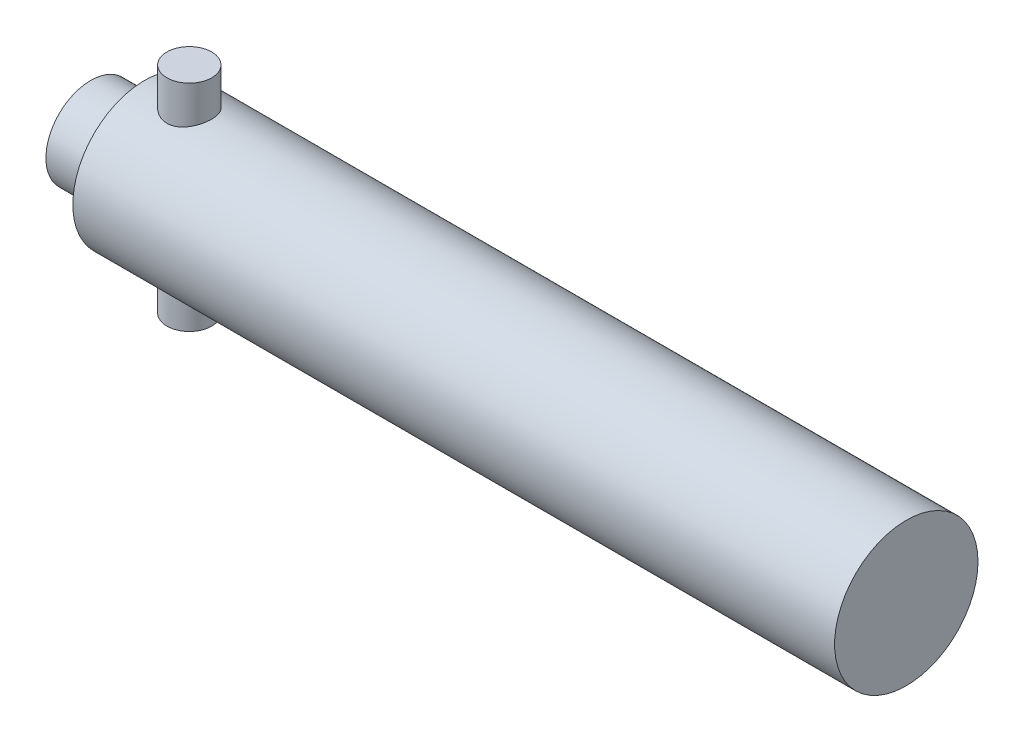
ISO-10303-21;
HEADER;
FILE_DESCRIPTION(('STEP AP214'),'2;1');
FILE_NAME('part.step','',(''),(''),'','','');
FILE_SCHEMA(('AUTOMOTIVE_DESIGN { 1 0 10303 214 1 1 1 1 }'));
ENDSEC;
DATA;
#1=APPLICATION_CONTEXT('core data for automotive mechanical design processes');
#2=APPLICATION_PROTOCOL_DEFINITION('international standard','automotive_design',2000,#1);
#3=PRODUCT_CONTEXT('',#1,'mechanical');
#4=PRODUCT('Part','Part','',(#3));
#5=PRODUCT_RELATED_PRODUCT_CATEGORY('part','',(#4));
#6=PRODUCT_DEFINITION_FORMATION('','',#4);
#7=PRODUCT_DEFINITION_CONTEXT('part definition',#1,'design');
#8=PRODUCT_DEFINITION('design','',#6,#7);
#9=PRODUCT_DEFINITION_SHAPE('','',#8);
#10=(LENGTH_UNIT() NAMED_UNIT(*) SI_UNIT(.MILLI.,.METRE.));
#11=(NAMED_UNIT(*) PLANE_ANGLE_UNIT() SI_UNIT($,.RADIAN.));
#12=(NAMED_UNIT(*) SI_UNIT($,.STERADIAN.) SOLID_ANGLE_UNIT());
#13=UNCERTAINTY_MEASURE_WITH_UNIT(LENGTH_MEASURE(1.E-05),#10,'distance_accuracy_value','');
#14=(GEOMETRIC_REPRESENTATION_CONTEXT(3) GLOBAL_UNCERTAINTY_ASSIGNED_CONTEXT((#13)) GLOBAL_UNIT_ASSIGNED_CONTEXT((#10,
#11,#12)) REPRESENTATION_CONTEXT('',''));
#15=CARTESIAN_POINT('',(0.,0.,0.));
#16=DIRECTION('',(0.,0.,1.));
#17=DIRECTION('',(1.,0.,0.));
#18=AXIS2_PLACEMENT_3D('',#15,#16,#17);
#19=CARTESIAN_POINT('',(539.75,0.,0.));
#20=DIRECTION('',(-1.,0.,0.));
#21=DIRECTION('',(0.,0.,1.));
#22=AXIS2_PLACEMENT_3D('',#19,#20,#21);
#23=CYLINDRICAL_SURFACE('',#22,101.6);
#24=CARTESIAN_POINT('',(539.75,0.,0.));
#25=DIRECTION('',(1.,0.,0.));
#26=DIRECTION('',(0.,0.,-1.));
#27=AXIS2_PLACEMENT_3D('',#24,#25,#26);
#28=CIRCLE('',#27,101.6);
#29=CARTESIAN_POINT('',(539.75,0.,-101.6));
#30=VERTEX_POINT('',#29);
#31=EDGE_CURVE('E62',#30,#30,#28,.T.);
#32=ORIENTED_EDGE('',*,*,#31,.F.);
#33=EDGE_LOOP('',(#32));
#34=FACE_BOUND('',#33,.T.);
#35=CARTESIAN_POINT('',(-539.75,0.,0.));
#36=DIRECTION('',(1.,0.,0.));
#37=DIRECTION('',(0.,0.,-1.));
#38=AXIS2_PLACEMENT_3D('',#35,#36,#37);
#39=CIRCLE('',#38,101.6);
#40=CARTESIAN_POINT('',(-539.75,0.,-101.6));
#41=VERTEX_POINT('',#40);
#42=EDGE_CURVE('E58',#41,#41,#39,.T.);
#43=ORIENTED_EDGE('',*,*,#42,.T.);
#44=EDGE_LOOP('',(#43));
#45=FACE_BOUND('',#44,.T.);
#46=CARTESIAN_POINT('',(-476.25,-96.5116443751737,-31.75));
#47=CARTESIAN_POINT('',(-475.381969677895,-96.5116451670047,-31.7499989798817));
#48=CARTESIAN_POINT('',(-474.513922051287,-96.5233868502887,-31.7143728151661));
#49=CARTESIAN_POINT('',(-472.784272924989,-96.5699811755499,-31.5722073144169));
#50=CARTESIAN_POINT('',(-471.92267160065,-96.6048344439135,-31.4656660563921));
#51=CARTESIAN_POINT('',(-470.212034498799,-96.6965605784097,-31.1826434371606));
#52=CARTESIAN_POINT('',(-469.363001642817,-96.7534384832297,-31.0061460715228));
#53=CARTESIAN_POINT('',(-467.68372328467,-96.8874500462763,-30.584813407392));
#54=CARTESIAN_POINT('',(-466.853477766978,-96.9645836877616,-30.3399781653794));
#55=CARTESIAN_POINT('',(-465.218888379056,-97.1366224475111,-29.7845740362748));
#56=CARTESIAN_POINT('',(-464.414500358494,-97.2314951559143,-29.4741248951955));
#57=CARTESIAN_POINT('',(-462.835238383269,-97.4363390993219,-28.7897087101453));
#58=CARTESIAN_POINT('',(-462.06036440786,-97.5463103237122,-28.4157417108259));
#59=CARTESIAN_POINT('',(-460.544795653733,-97.7782694287678,-27.6070085347753));
#60=CARTESIAN_POINT('',(-459.804105262858,-97.9002588458367,-27.172234581504));
#61=CARTESIAN_POINT('',(-458.36138460391,-98.1529191087325,-26.2449107363933));
#62=CARTESIAN_POINT('',(-457.659355262442,-98.28359016247,-25.7523594606679));
#63=CARTESIAN_POINT('',(-456.276807590266,-98.5543104019426,-24.6964380994645));
#64=CARTESIAN_POINT('',(-455.597641199905,-98.6945249362583,-24.1313395250295));
#65=CARTESIAN_POINT('',(-454.288918927031,-98.9766546975334,-22.9467311893278));
#66=CARTESIAN_POINT('',(-453.65936396741,-99.1185699560738,-22.3272204163179));
#67=CARTESIAN_POINT('',(-452.453729001468,-99.4002834155522,-21.0375677890379));
#68=CARTESIAN_POINT('',(-451.877656175272,-99.5400813301286,-20.3674191583382));
#69=CARTESIAN_POINT('',(-450.782834732152,-99.8137916359836,-18.9806854136896));
#70=CARTESIAN_POINT('',(-450.264086570348,-99.9477039805296,-18.2640999311353));
#71=CARTESIAN_POINT('',(-449.276408029371,-100.208982378514,-16.7721839405678));
#72=CARTESIAN_POINT('',(-448.80887411266,-100.336131121173,-15.9958897801277));
#73=CARTESIAN_POINT('',(-447.941101223515,-100.576922835051,-14.4045172892275));
#74=CARTESIAN_POINT('',(-447.540863569318,-100.690565541693,-13.5894381994274));
#75=CARTESIAN_POINT('',(-446.811071385049,-100.901069871515,-11.9262928598228));
#76=CARTESIAN_POINT('',(-446.481504012756,-100.997934542988,-11.0782326365041));
#77=CARTESIAN_POINT('',(-445.895894899245,-101.17208588931,-9.35514296371683));
#78=CARTESIAN_POINT('',(-445.639850418506,-101.249373293612,-8.48011452045113));
#79=CARTESIAN_POINT('',(-445.210423089129,-101.380039020762,-6.73704728667637));
#80=CARTESIAN_POINT('',(-445.034732560005,-101.434081741132,-5.86962653036055));
#81=CARTESIAN_POINT('',(-444.756288962768,-101.520115016805,-4.12207094028613));
#82=CARTESIAN_POINT('',(-444.65353453041,-101.552105984579,-3.24193634464989));
#83=CARTESIAN_POINT('',(-444.521960017491,-101.593120370437,-1.47579714485987));
#84=CARTESIAN_POINT('',(-444.49312543731,-101.602148292796,-0.589793726084896));
#85=CARTESIAN_POINT('',(-444.509630931212,-101.596990358912,1.18144498005426));
#86=CARTESIAN_POINT('',(-444.554969516513,-101.582804968598,2.06668028247901));
#87=CARTESIAN_POINT('',(-444.716526981583,-101.532516072369,3.79909132953033));
#88=CARTESIAN_POINT('',(-444.830240678498,-101.497187435003,4.6465246528835));
#89=CARTESIAN_POINT('',(-445.125364055328,-101.406216625182,6.32838403875714));
#90=CARTESIAN_POINT('',(-445.30677189855,-101.350575003865,7.16281045354411));
#91=CARTESIAN_POINT('',(-445.735733166584,-101.220433987972,8.81299363755912));
#92=CARTESIAN_POINT('',(-445.983289043875,-101.145933894214,9.6287497133554));
#93=CARTESIAN_POINT('',(-446.542518037744,-100.980001641567,11.2362013719097));
#94=CARTESIAN_POINT('',(-446.854192449248,-100.888569140719,12.0278964683664));
#95=CARTESIAN_POINT('',(-447.543432976462,-100.689891802238,13.5917088494713));
#96=CARTESIAN_POINT('',(-447.921757157604,-100.582467528636,14.3634690642786));
#97=CARTESIAN_POINT('',(-448.7388189262,-100.355411586515,15.8724158526172));
#98=CARTESIAN_POINT('',(-449.177556740216,-100.235779872216,16.6096022964773));
#99=CARTESIAN_POINT('',(-450.112502262845,-99.9873152520785,18.0451546519251));
#100=CARTESIAN_POINT('',(-450.608721944574,-99.858480431441,18.7435124307492));
#101=CARTESIAN_POINT('',(-451.655336304049,-99.5948721191023,20.0971898846733));
#102=CARTESIAN_POINT('',(-452.205732504696,-99.4600984605196,20.7525083490761));
#103=CARTESIAN_POINT('',(-453.38134775542,-99.1823227401719,22.0426926602451));
#104=CARTESIAN_POINT('',(-454.008730039117,-99.0392119313202,22.6755655885787));
#105=CARTESIAN_POINT('',(-455.314603882386,-98.7541511870177,23.8864952157735));
#106=CARTESIAN_POINT('',(-455.99309688317,-98.6122012844271,24.4645503678537));
#107=CARTESIAN_POINT('',(-457.397026951549,-98.3334064700594,25.5621183833457));
#108=CARTESIAN_POINT('',(-458.122469837508,-98.1965621943333,26.0816239689277));
#109=CARTESIAN_POINT('',(-459.615675610736,-97.9319072635223,27.0584124266439));
#110=CARTESIAN_POINT('',(-460.383438353357,-97.804096577564,27.5156955114369));
#111=CARTESIAN_POINT('',(-461.965228548705,-97.5599042391345,28.3694296310796));
#112=CARTESIAN_POINT('',(-462.779679014548,-97.4436671938668,28.7651391537138));
#113=CARTESIAN_POINT('',(-464.441313901456,-97.2278977538031,29.4862282194784));
#114=CARTESIAN_POINT('',(-465.288498725316,-97.1283655646402,29.8116068968655));
#115=CARTESIAN_POINT('',(-467.009288007874,-96.9492462836408,30.3890623619716));
#116=CARTESIAN_POINT('',(-467.882884598445,-96.8696533162139,30.641160747081));
#117=CARTESIAN_POINT('',(-469.650151084086,-96.7330326696111,31.0697781465098));
#118=CARTESIAN_POINT('',(-470.543820089949,-96.6760039929126,31.2463005019238));
#119=CARTESIAN_POINT('',(-472.308021744607,-96.5882597965891,31.5164621739086));
#120=CARTESIAN_POINT('',(-473.178040926753,-96.5565789416421,31.6131471952657));
#121=CARTESIAN_POINT('',(-474.923623370444,-96.5168147639428,31.7343440182681));
#122=CARTESIAN_POINT('',(-475.799186483216,-96.5087308106326,31.7588577484798));
#123=CARTESIAN_POINT('',(-477.549112230007,-96.5164219822188,31.7354757727173));
#124=CARTESIAN_POINT('',(-478.423475014223,-96.5321937846891,31.6875901499077));
#125=CARTESIAN_POINT('',(-480.164525139063,-96.5870795826674,31.5198955945349));
#126=CARTESIAN_POINT('',(-481.031212553791,-96.6261933525651,31.4000873571351));
#127=CARTESIAN_POINT('',(-482.725563545693,-96.7250528321715,31.0941974096744));
#128=CARTESIAN_POINT('',(-483.553630150111,-96.7841677698192,30.9101369538135));
#129=CARTESIAN_POINT('',(-485.190887990534,-96.9214706861785,30.4768782071948));
#130=CARTESIAN_POINT('',(-486.000079679506,-96.9996582066628,30.2276814813545));
#131=CARTESIAN_POINT('',(-487.594483091379,-97.1728696608586,29.6661364092645));
#132=CARTESIAN_POINT('',(-488.379691921194,-97.2678956164827,29.3537804783959));
#133=CARTESIAN_POINT('',(-489.92118697613,-97.4721242866476,28.6683243449778));
#134=CARTESIAN_POINT('',(-490.677472339485,-97.5813274231673,28.2952223342581));
#135=CARTESIAN_POINT('',(-492.177976714023,-97.8142786026435,27.4792994714734));
#136=CARTESIAN_POINT('',(-492.92122833799,-97.9383538568733,27.0347866312349));
#137=CARTESIAN_POINT('',(-494.006066176379,-98.1307726236237,26.3243541583424));
#138=CARTESIAN_POINT('',(-494.362690160681,-98.1959667891114,26.0802521413596));
#139=CARTESIAN_POINT('',(-495.065563064148,-98.3280416328819,25.5777977034132));
#140=CARTESIAN_POINT('',(-495.411809580904,-98.3949226951862,25.3194420214197));
#141=CARTESIAN_POINT('',(-496.434117196091,-98.5974134989207,24.5236550729191));
#142=CARTESIAN_POINT('',(-497.093814574931,-98.7348830890183,23.9654592085498));
#143=CARTESIAN_POINT('',(-498.365391040439,-99.0111240695357,22.7973107361091));
#144=CARTESIAN_POINT('',(-498.97726920783,-99.1498954849245,22.1873571335165));
#145=CARTESIAN_POINT('',(-499.868577791557,-99.3591800349055,21.2232793946207));
#146=CARTESIAN_POINT('',(-500.16684215275,-99.4305442947347,20.8865853750696));
#147=CARTESIAN_POINT('',(-500.748839563717,-99.5721396973692,20.2007820744333));
#148=CARTESIAN_POINT('',(-501.032576045194,-99.6423711050614,19.8516757586394));
#149=CARTESIAN_POINT('',(-501.861420884825,-99.850669642653,18.7863516429658));
#150=CARTESIAN_POINT('',(-502.384209058797,-99.9863516264663,18.0520806271221));
#151=CARTESIAN_POINT('',(-503.366135834801,-100.247484753934,16.5405597567202));
#152=CARTESIAN_POINT('',(-503.825275520396,-100.372936071742,15.7633106341445));
#153=CARTESIAN_POINT('',(-504.676468356476,-100.610111266224,14.1708618574423));
#154=CARTESIAN_POINT('',(-505.068522858264,-100.721835419392,13.3556629681628));
#155=CARTESIAN_POINT('',(-505.779657808274,-100.927613332156,11.6990742475918));
#156=CARTESIAN_POINT('',(-506.099254269946,-101.021791132392,10.8579214326155));
#157=CARTESIAN_POINT('',(-506.666355046036,-101.190804089143,9.14973544602849));
#158=CARTESIAN_POINT('',(-506.913859373766,-101.265639249231,8.28270227919714));
#159=CARTESIAN_POINT('',(-507.334426107264,-101.393781357175,6.52942924389282));
#160=CARTESIAN_POINT('',(-507.507507825853,-101.447093889978,5.64319442106905));
#161=CARTESIAN_POINT('',(-507.777638130755,-101.530650093933,3.85814481155571));
#162=CARTESIAN_POINT('',(-507.874689519339,-101.560894615308,2.95933048975536));
#163=CARTESIAN_POINT('',(-507.989360446746,-101.596662015788,1.19381073601245));
#164=CARTESIAN_POINT('',(-508.010120693371,-101.603162312137,0.327327598956075));
#165=CARTESIAN_POINT('',(-507.980745786436,-101.593983648031,-1.40430190045025));
#166=CARTESIAN_POINT('',(-507.930612730558,-101.578305343825,-2.26944830159495));
#167=CARTESIAN_POINT('',(-507.759924519796,-101.525200283407,-3.99202133563812));
#168=CARTESIAN_POINT('',(-507.639374106193,-101.487774991444,-4.84944848433611));
#169=CARTESIAN_POINT('',(-507.328951208439,-101.392193629452,-6.55047837444202));
#170=CARTESIAN_POINT('',(-507.139078479587,-101.334037486246,-7.39408106703989));
#171=CARTESIAN_POINT('',(-506.694492043494,-101.199408799385,-9.05107758845541));
#172=CARTESIAN_POINT('',(-506.440622420029,-101.123175406777,-9.86471772398901));
#173=CARTESIAN_POINT('',(-505.868993674698,-100.953988511858,-11.4674135010197));
#174=CARTESIAN_POINT('',(-505.551235394424,-100.861035229796,-12.2564694662008));
#175=CARTESIAN_POINT('',(-504.85422477718,-100.660755944511,-13.8051437293551));
#176=CARTESIAN_POINT('',(-504.474964616964,-100.5534281131,-14.5647582670289));
#177=CARTESIAN_POINT('',(-503.657704493529,-100.327093273025,-16.0498808398705));
#178=CARTESIAN_POINT('',(-503.219702839328,-100.208085928172,-16.7753878923794));
#179=CARTESIAN_POINT('',(-502.272094852146,-99.9571468003044,-18.2120412776282));
#180=CARTESIAN_POINT('',(-501.760563625417,-99.8249135446923,-18.9218657309421));
#181=CARTESIAN_POINT('',(-500.681310649424,-99.5545758871187,-20.2962320546217));
#182=CARTESIAN_POINT('',(-500.113587736224,-99.4164713635755,-20.9607729865179));
#183=CARTESIAN_POINT('',(-498.925414269352,-99.1379763521186,-22.2407465745816));
#184=CARTESIAN_POINT('',(-498.30494926048,-98.9975852460919,-22.8561656775733));
#185=CARTESIAN_POINT('',(-497.015233485657,-98.7182665473738,-24.0339393509743));
#186=CARTESIAN_POINT('',(-496.345982041661,-98.5793389750538,-24.5962931836212));
#187=CARTESIAN_POINT('',(-494.93974452979,-98.3021535235925,-25.6821142255678));
#188=CARTESIAN_POINT('',(-494.201247751475,-98.1640708386015,-26.2036718690836));
#189=CARTESIAN_POINT('',(-492.681193528928,-97.8975069078193,-27.1826347235231));
#190=CARTESIAN_POINT('',(-491.899634410397,-97.7690260358125,-27.6400374375963));
#191=CARTESIAN_POINT('',(-490.298900416217,-97.5256051517723,-28.4870240323994));
#192=CARTESIAN_POINT('',(-489.479738413591,-97.410660553056,-28.8766309068293));
#193=CARTESIAN_POINT('',(-487.809205006086,-97.1978739870539,-29.5849657542392));
#194=CARTESIAN_POINT('',(-486.957836273762,-97.100030604459,-29.9036995933188));
#195=CARTESIAN_POINT('',(-485.302756709763,-96.9320947950975,-30.4434209195731));
#196=CARTESIAN_POINT('',(-484.501170729247,-96.8603476468594,-30.6704250039047));
#197=CARTESIAN_POINT('',(-482.881257142156,-96.7358213734409,-31.060955514167));
#198=CARTESIAN_POINT('',(-482.062930674591,-96.6830409622838,-31.2244862437579));
#199=CARTESIAN_POINT('',(-480.415062368291,-96.5979729659136,-31.4866742850421));
#200=CARTESIAN_POINT('',(-479.585522895872,-96.5656811238152,-31.5853450727608));
#201=CARTESIAN_POINT('',(-477.920661108577,-96.5225160253668,-31.7170097153163));
#202=CARTESIAN_POINT('',(-477.08533856709,-96.5116436131646,-31.7500009816985));
#203=CARTESIAN_POINT('',(-476.25,-96.5116443751737,-31.75));
#204=B_SPLINE_CURVE_WITH_KNOTS('',3,(#46,#47,#48,#49,#50,#51,#52,#53,#54,#55,#56,#57,#58,#59,
#60,#61,#62,#63,#64,#65,#66,#67,#68,#69,#70,#71,#72,#73,#74,#75,#76,#77,#78,#79,#80,#81,#82,#83,
#84,#85,#86,#87,#88,#89,#90,#91,#92,#93,#94,#95,#96,#97,#98,#99,#100,#101,#102,#103,#104,#105,
#106,#107,#108,#109,#110,#111,#112,#113,#114,#115,#116,#117,#118,#119,#120,#121,#122,#123,#124,
#125,#126,#127,#128,#129,#130,#131,#132,#133,#134,#135,#136,#137,#138,#139,#140,#141,#142,#143,
#144,#145,#146,#147,#148,#149,#150,#151,#152,#153,#154,#155,#156,#157,#158,#159,#160,#161,#162,
#163,#164,#165,#166,#167,#168,#169,#170,#171,#172,#173,#174,#175,#176,#177,#178,#179,#180,#181,
#182,#183,#184,#185,#186,#187,#188,#189,#190,#191,#192,#193,#194,#195,#196,#197,#198,#199,#200,
#201,#202,#203),.UNSPECIFIED.,.T.,.F.,(4,2,2,2,2,2,2,2,2,2,2,2,2,2,2,2,2,2,2,2,2,2,2,2,2,2,2,2,
2,2,2,2,2,2,2,2,2,2,2,2,2,2,2,2,2,2,2,2,2,2,2,2,2,2,2,2,2,2,2,2,2,2,2,2,2,2,2,2,2,2,2,2,2,2,2,2,
2,2,4),(0.,2.60331470834522,5.20669997644033,7.81068118638201,10.4146602441773,13.0139274284392,
15.6131927854833,18.212790864446,20.8124512218671,23.4931179898877,26.1738346129214,
28.8549106107349,31.5360078929421,34.2779036968347,37.0198532042851,39.7613040209559,
42.5026526757475,45.1593793724529,47.8160563746581,50.4722122211086,53.1283147546671,
55.6925718658061,58.2567594080045,60.8210420321971,63.3853764491962,65.9810210999692,
68.5766754851077,71.1728715043717,73.7691405234558,76.4736918503091,79.1783194681899,
81.883282906836,84.5882371004543,87.3235945199622,90.0589856086653,92.7935696953035,
95.5280328778971,98.1526075093155,100.777112006027,103.401251017798,106.025364666534,
108.573430456487,111.121435034052,113.66974577654,116.218132386018,118.839572129573,
120.15042993299,121.461588895268,124.083660162163,126.705781823375,128.071715136629,
129.437324293254,132.168344406095,134.899318019823,137.630236616777,140.341049075631,
143.051861033877,145.761969105614,148.471977285415,151.069085953812,153.666117777278,
156.262974759832,158.859840909141,161.424100567555,163.988326449736,166.552878766318,
169.117504924101,171.769123998777,174.420798009705,177.073201131513,179.725641124046,
182.466096221723,185.206657945794,187.946288359029,190.685691930957,193.191552590531,
195.697243316476,198.202413267462,200.707681946187),.UNSPECIFIED.);
#205=CARTESIAN_POINT('',(-476.25,-96.5116443751737,-31.75));
#206=VERTEX_POINT('',#205);
#207=EDGE_CURVE('E51',#206,#206,#204,.T.);
#208=ORIENTED_EDGE('',*,*,#207,.F.);
#209=EDGE_LOOP('',(#208));
#210=FACE_BOUND('',#209,.T.);
#211=CARTESIAN_POINT('',(-476.25,96.5116443751737,-31.75));
#212=CARTESIAN_POINT('',(-477.118030322105,96.5116451670048,-31.7499989798817));
#213=CARTESIAN_POINT('',(-477.986077948713,96.5233868502887,-31.7143728151661));
#214=CARTESIAN_POINT('',(-479.715727075011,96.5699811755499,-31.5722073144169));
#215=CARTESIAN_POINT('',(-480.57732839935,96.6048344439135,-31.4656660563921));
#216=CARTESIAN_POINT('',(-482.287965501201,96.6965605784097,-31.1826434371606));
#217=CARTESIAN_POINT('',(-483.136998357183,96.7534384832297,-31.0061460715228));
#218=CARTESIAN_POINT('',(-484.81627671533,96.8874500462763,-30.584813407392));
#219=CARTESIAN_POINT('',(-485.646522233022,96.9645836877616,-30.3399781653794));
#220=CARTESIAN_POINT('',(-487.281111620944,97.1366224475111,-29.7845740362748));
#221=CARTESIAN_POINT('',(-488.085499641506,97.2314951559143,-29.4741248951955));
#222=CARTESIAN_POINT('',(-489.664761616731,97.4363390993219,-28.7897087101452));
#223=CARTESIAN_POINT('',(-490.43963559214,97.5463103237123,-28.4157417108259));
#224=CARTESIAN_POINT('',(-491.955204346267,97.7782694287678,-27.6070085347753));
#225=CARTESIAN_POINT('',(-492.695894737142,97.9002588458367,-27.172234581504));
#226=CARTESIAN_POINT('',(-494.13861539609,98.1529191087325,-26.2449107363933));
#227=CARTESIAN_POINT('',(-494.840644737558,98.28359016247,-25.7523594606679));
#228=CARTESIAN_POINT('',(-496.223192409734,98.5543104019427,-24.6964380994645));
#229=CARTESIAN_POINT('',(-496.902358800095,98.6945249362583,-24.1313395250295));
#230=CARTESIAN_POINT('',(-498.211081072969,98.9766546975334,-22.9467311893278));
#231=CARTESIAN_POINT('',(-498.84063603259,99.1185699560738,-22.3272204163179));
#232=CARTESIAN_POINT('',(-500.046270998532,99.4002834155522,-21.0375677890379));
#233=CARTESIAN_POINT('',(-500.622343824728,99.5400813301286,-20.3674191583382));
#234=CARTESIAN_POINT('',(-501.717165267847,99.8137916359836,-18.9806854136896));
#235=CARTESIAN_POINT('',(-502.235913429652,99.9477039805296,-18.2640999311353));
#236=CARTESIAN_POINT('',(-503.223591970628,100.208982378514,-16.7721839405678));
#237=CARTESIAN_POINT('',(-503.69112588734,100.336131121173,-15.9958897801276));
#238=CARTESIAN_POINT('',(-504.558898776485,100.576922835051,-14.4045172892275));
#239=CARTESIAN_POINT('',(-504.959136430682,100.690565541693,-13.5894381994274));
#240=CARTESIAN_POINT('',(-505.688928614951,100.901069871515,-11.9262928598228));
#241=CARTESIAN_POINT('',(-506.018495987244,100.997934542988,-11.078232636504));
#242=CARTESIAN_POINT('',(-506.604105100755,101.17208588931,-9.35514296371678));
#243=CARTESIAN_POINT('',(-506.860149581494,101.249373293612,-8.48011452045109));
#244=CARTESIAN_POINT('',(-507.289576910871,101.380039020762,-6.73704728667633));
#245=CARTESIAN_POINT('',(-507.465267439995,101.434081741132,-5.86962653036051));
#246=CARTESIAN_POINT('',(-507.743711037232,101.520115016805,-4.1220709402861));
#247=CARTESIAN_POINT('',(-507.84646546959,101.552105984579,-3.24193634464987));
#248=CARTESIAN_POINT('',(-507.978039982509,101.593120370437,-1.47579714485986));
#249=CARTESIAN_POINT('',(-508.00687456269,101.602148292796,-0.589793726084883));
#250=CARTESIAN_POINT('',(-507.990369068788,101.596990358912,1.18144498005427));
#251=CARTESIAN_POINT('',(-507.945030483486,101.582804968598,2.06668028247902));
#252=CARTESIAN_POINT('',(-507.783473018417,101.532516072369,3.79909132953034));
#253=CARTESIAN_POINT('',(-507.669759321501,101.497187435003,4.64652465288352));
#254=CARTESIAN_POINT('',(-507.374635944671,101.406216625182,6.32838403875716));
#255=CARTESIAN_POINT('',(-507.19322810145,101.350575003865,7.16281045354412));
#256=CARTESIAN_POINT('',(-506.764266833416,101.220433987972,8.81299363755913));
#257=CARTESIAN_POINT('',(-506.516710956125,101.145933894214,9.62874971335542));
#258=CARTESIAN_POINT('',(-505.957481962256,100.980001641567,11.2362013719097));
#259=CARTESIAN_POINT('',(-505.645807550752,100.888569140719,12.0278964683664));
#260=CARTESIAN_POINT('',(-504.956567023538,100.689891802238,13.5917088494713));
#261=CARTESIAN_POINT('',(-504.578242842396,100.582467528636,14.3634690642786));
#262=CARTESIAN_POINT('',(-503.7611810738,100.355411586515,15.8724158526172));
#263=CARTESIAN_POINT('',(-503.322443259784,100.235779872216,16.6096022964773));
#264=CARTESIAN_POINT('',(-502.387497737155,99.9873152520785,18.0451546519251));
#265=CARTESIAN_POINT('',(-501.891278055426,99.858480431441,18.7435124307491));
#266=CARTESIAN_POINT('',(-500.844663695951,99.5948721191023,20.0971898846732));
#267=CARTESIAN_POINT('',(-500.294267495304,99.4600984605196,20.7525083490761));
#268=CARTESIAN_POINT('',(-499.11865224458,99.1823227401719,22.0426926602451));
#269=CARTESIAN_POINT('',(-498.491269960883,99.0392119313202,22.6755655885786));
#270=CARTESIAN_POINT('',(-497.185396117614,98.7541511870177,23.8864952157734));
#271=CARTESIAN_POINT('',(-496.50690311683,98.6122012844271,24.4645503678537));
#272=CARTESIAN_POINT('',(-495.10297304845,98.3334064700594,25.5621183833457));
#273=CARTESIAN_POINT('',(-494.377530162492,98.1965621943333,26.0816239689277));
#274=CARTESIAN_POINT('',(-492.884324389264,97.9319072635223,27.0584124266439));
#275=CARTESIAN_POINT('',(-492.116561646643,97.804096577564,27.5156955114369));
#276=CARTESIAN_POINT('',(-490.534771451294,97.5599042391345,28.3694296310796));
#277=CARTESIAN_POINT('',(-489.720320985452,97.4436671938668,28.7651391537138));
#278=CARTESIAN_POINT('',(-488.058686098544,97.2278977538031,29.4862282194784));
#279=CARTESIAN_POINT('',(-487.211501274684,97.1283655646402,29.8116068968655));
#280=CARTESIAN_POINT('',(-485.490711992126,96.9492462836408,30.3890623619716));
#281=CARTESIAN_POINT('',(-484.617115401555,96.8696533162139,30.641160747081));
#282=CARTESIAN_POINT('',(-482.849848915914,96.7330326696111,31.0697781465098));
#283=CARTESIAN_POINT('',(-481.956179910051,96.6760039929126,31.2463005019238));
#284=CARTESIAN_POINT('',(-480.191978255393,96.5882597965891,31.5164621739086));
#285=CARTESIAN_POINT('',(-479.321959073247,96.5565789416421,31.6131471952657));
#286=CARTESIAN_POINT('',(-477.576376629556,96.5168147639428,31.7343440182681));
#287=CARTESIAN_POINT('',(-476.700813516784,96.5087308106326,31.7588577484798));
#288=CARTESIAN_POINT('',(-474.950887769993,96.5164219822188,31.7354757727173));
#289=CARTESIAN_POINT('',(-474.076524985777,96.5321937846891,31.6875901499077));
#290=CARTESIAN_POINT('',(-472.335474860937,96.5870795826674,31.5198955945349));
#291=CARTESIAN_POINT('',(-471.468787446209,96.6261933525651,31.4000873571351));
#292=CARTESIAN_POINT('',(-469.774436454306,96.7250528321715,31.0941974096744));
#293=CARTESIAN_POINT('',(-468.946369849889,96.7841677698192,30.9101369538135));
#294=CARTESIAN_POINT('',(-467.309112009466,96.9214706861785,30.4768782071948));
#295=CARTESIAN_POINT('',(-466.499920320494,96.9996582066628,30.2276814813545));
#296=CARTESIAN_POINT('',(-464.905516908621,97.1728696608586,29.6661364092645));
#297=CARTESIAN_POINT('',(-464.120308078805,97.2678956164827,29.3537804783959));
#298=CARTESIAN_POINT('',(-462.57881302387,97.4721242866476,28.6683243449778));
#299=CARTESIAN_POINT('',(-461.822527660515,97.5813274231673,28.2952223342581));
#300=CARTESIAN_POINT('',(-460.322023285977,97.8142786026435,27.4792994714734));
#301=CARTESIAN_POINT('',(-459.57877166201,97.9383538568733,27.0347866312349));
#302=CARTESIAN_POINT('',(-458.493933823621,98.1307726236237,26.3243541583424));
#303=CARTESIAN_POINT('',(-458.137309839319,98.1959667891114,26.0802521413596));
#304=CARTESIAN_POINT('',(-457.434436935852,98.3280416328819,25.5777977034131));
#305=CARTESIAN_POINT('',(-457.088190419096,98.3949226951862,25.3194420214197));
#306=CARTESIAN_POINT('',(-456.065882803909,98.5974134989207,24.5236550729191));
#307=CARTESIAN_POINT('',(-455.406185425068,98.7348830890183,23.9654592085498));
#308=CARTESIAN_POINT('',(-454.134608959561,99.0111240695358,22.7973107361091));
#309=CARTESIAN_POINT('',(-453.52273079217,99.1498954849245,22.1873571335166));
#310=CARTESIAN_POINT('',(-452.631422208443,99.3591800349055,21.2232793946207));
#311=CARTESIAN_POINT('',(-452.33315784725,99.4305442947347,20.8865853750695));
#312=CARTESIAN_POINT('',(-451.751160436283,99.5721396973693,20.2007820744332));
#313=CARTESIAN_POINT('',(-451.467423954806,99.6423711050614,19.8516757586394));
#314=CARTESIAN_POINT('',(-450.638579115174,99.850669642653,18.7863516429658));
#315=CARTESIAN_POINT('',(-450.115790941203,99.9863516264663,18.0520806271221));
#316=CARTESIAN_POINT('',(-449.133864165199,100.247484753934,16.5405597567202));
#317=CARTESIAN_POINT('',(-448.674724479603,100.372936071742,15.7633106341445));
#318=CARTESIAN_POINT('',(-447.823531643524,100.610111266224,14.1708618574422));
#319=CARTESIAN_POINT('',(-447.431477141736,100.721835419392,13.3556629681627));
#320=CARTESIAN_POINT('',(-446.720342191726,100.927613332156,11.6990742475917));
#321=CARTESIAN_POINT('',(-446.400745730053,101.021791132392,10.8579214326155));
#322=CARTESIAN_POINT('',(-445.833644953964,101.190804089143,9.14973544602845));
#323=CARTESIAN_POINT('',(-445.586140626233,101.265639249231,8.28270227919709));
#324=CARTESIAN_POINT('',(-445.165573892736,101.393781357175,6.52942924389277));
#325=CARTESIAN_POINT('',(-444.992492174147,101.447093889978,5.643194421069));
#326=CARTESIAN_POINT('',(-444.722361869245,101.530650093933,3.85814481155568));
#327=CARTESIAN_POINT('',(-444.625310480661,101.560894615308,2.95933048975534));
#328=CARTESIAN_POINT('',(-444.510639553254,101.596662015788,1.19381073601244));
#329=CARTESIAN_POINT('',(-444.489879306629,101.603162312137,0.327327598956057));
#330=CARTESIAN_POINT('',(-444.519254213563,101.593983648031,-1.40430190045026));
#331=CARTESIAN_POINT('',(-444.569387269442,101.578305343825,-2.26944830159496));
#332=CARTESIAN_POINT('',(-444.740075480204,101.525200283407,-3.99202133563812));
#333=CARTESIAN_POINT('',(-444.860625893807,101.487774991444,-4.84944848433612));
#334=CARTESIAN_POINT('',(-445.171048791561,101.392193629452,-6.55047837444202));
#335=CARTESIAN_POINT('',(-445.360921520413,101.334037486246,-7.39408106703988));
#336=CARTESIAN_POINT('',(-445.805507956506,101.199408799385,-9.05107758845541));
#337=CARTESIAN_POINT('',(-446.059377579971,101.123175406777,-9.86471772398902));
#338=CARTESIAN_POINT('',(-446.631006325301,100.953988511858,-11.4674135010198));
#339=CARTESIAN_POINT('',(-446.948764605576,100.861035229796,-12.2564694662008));
#340=CARTESIAN_POINT('',(-447.64577522282,100.660755944511,-13.8051437293552));
#341=CARTESIAN_POINT('',(-448.025035383036,100.5534281131,-14.5647582670289));
#342=CARTESIAN_POINT('',(-448.842295506471,100.327093273025,-16.0498808398705));
#343=CARTESIAN_POINT('',(-449.280297160671,100.208085928172,-16.7753878923794));
#344=CARTESIAN_POINT('',(-450.227905147854,99.9571468003044,-18.2120412776282));
#345=CARTESIAN_POINT('',(-450.739436374583,99.8249135446923,-18.9218657309421));
#346=CARTESIAN_POINT('',(-451.818689350576,99.5545758871187,-20.2962320546217));
#347=CARTESIAN_POINT('',(-452.386412263776,99.4164713635755,-20.9607729865179));
#348=CARTESIAN_POINT('',(-453.574585730648,99.1379763521186,-22.2407465745816));
#349=CARTESIAN_POINT('',(-454.19505073952,98.9975852460919,-22.8561656775733));
#350=CARTESIAN_POINT('',(-455.484766514343,98.7182665473739,-24.0339393509742));
#351=CARTESIAN_POINT('',(-456.154017958338,98.5793389750538,-24.5962931836211));
#352=CARTESIAN_POINT('',(-457.56025547021,98.3021535235925,-25.6821142255678));
#353=CARTESIAN_POINT('',(-458.298752248525,98.1640708386015,-26.2036718690836));
#354=CARTESIAN_POINT('',(-459.818806471072,97.8975069078193,-27.1826347235231));
#355=CARTESIAN_POINT('',(-460.600365589603,97.7690260358125,-27.6400374375963));
#356=CARTESIAN_POINT('',(-462.201099583783,97.5256051517723,-28.4870240323994));
#357=CARTESIAN_POINT('',(-463.020261586409,97.410660553056,-28.8766309068293));
#358=CARTESIAN_POINT('',(-464.690794993913,97.1978739870539,-29.5849657542392));
#359=CARTESIAN_POINT('',(-465.542163726238,97.100030604459,-29.9036995933187));
#360=CARTESIAN_POINT('',(-467.197243290237,96.9320947950975,-30.4434209195731));
#361=CARTESIAN_POINT('',(-467.998829270753,96.8603476468595,-30.6704250039047));
#362=CARTESIAN_POINT('',(-469.618742857844,96.7358213734409,-31.060955514167));
#363=CARTESIAN_POINT('',(-470.437069325409,96.6830409622838,-31.2244862437579));
#364=CARTESIAN_POINT('',(-472.084937631709,96.5979729659136,-31.4866742850421));
#365=CARTESIAN_POINT('',(-472.914477104128,96.5656811238152,-31.5853450727607));
#366=CARTESIAN_POINT('',(-474.579338891423,96.5225160253668,-31.7170097153163));
#367=CARTESIAN_POINT('',(-475.41466143291,96.5116436131647,-31.7500009816985));
#368=CARTESIAN_POINT('',(-476.25,96.5116443751737,-31.75));
#369=B_SPLINE_CURVE_WITH_KNOTS('',3,(#211,#212,#213,#214,#215,#216,#217,#218,#219,#220,#221,
#222,#223,#224,#225,#226,#227,#228,#229,#230,#231,#232,#233,#234,#235,#236,#237,#238,#239,#240,
#241,#242,#243,#244,#245,#246,#247,#248,#249,#250,#251,#252,#253,#254,#255,#256,#257,#258,#259,
#260,#261,#262,#263,#264,#265,#266,#267,#268,#269,#270,#271,#272,#273,#274,#275,#276,#277,#278,
#279,#280,#281,#282,#283,#284,#285,#286,#287,#288,#289,#290,#291,#292,#293,#294,#295,#296,#297,
#298,#299,#300,#301,#302,#303,#304,#305,#306,#307,#308,#309,#310,#311,#312,#313,#314,#315,#316,
#317,#318,#319,#320,#321,#322,#323,#324,#325,#326,#327,#328,#329,#330,#331,#332,#333,#334,#335,
#336,#337,#338,#339,#340,#341,#342,#343,#344,#345,#346,#347,#348,#349,#350,#351,#352,#353,#354,
#355,#356,#357,#358,#359,#360,#361,#362,#363,#364,#365,#366,#367,#368),.UNSPECIFIED.,.T.,.F.,(4,
2,2,2,2,2,2,2,2,2,2,2,2,2,2,2,2,2,2,2,2,2,2,2,2,2,2,2,2,2,2,2,2,2,2,2,2,2,2,2,2,2,2,2,2,2,2,2,2,
2,2,2,2,2,2,2,2,2,2,2,2,2,2,2,2,2,2,2,2,2,2,2,2,2,2,2,2,2,4),(0.,2.60331470834522,
5.20669997644033,7.81068118638201,10.4146602441773,13.0139274284393,15.6131927854833,
18.2127908644461,20.8124512218671,23.4931179898878,26.1738346129214,28.8549106107349,
31.5360078929421,34.2779036968348,37.0198532042852,39.761304020956,42.5026526757476,
45.1593793724529,47.8160563746581,50.4722122211086,53.1283147546671,55.6925718658061,
58.2567594080045,60.8210420321971,63.3853764491962,65.9810210999692,68.5766754851076,
71.1728715043716,73.7691405234557,76.473691850309,79.1783194681899,81.883282906836,
84.5882371004543,87.3235945199621,90.0589856086653,92.7935696953035,95.528032877897,
98.1526075093155,100.777112006027,103.401251017798,106.025364666534,108.573430456487,
111.121435034052,113.66974577654,116.218132386018,118.839572129573,120.15042993299,
121.461588895268,124.083660162163,126.705781823375,128.071715136629,129.437324293254,
132.168344406095,134.899318019823,137.630236616777,140.341049075631,143.051861033877,
145.761969105614,148.471977285415,151.069085953812,153.666117777278,156.262974759832,
158.859840909141,161.424100567555,163.988326449736,166.552878766318,169.117504924101,
171.769123998777,174.420798009705,177.073201131513,179.725641124046,182.466096221722,
185.206657945794,187.946288359029,190.685691930957,193.19155259053,195.697243316476,
198.202413267462,200.707681946187),.UNSPECIFIED.);
#370=CARTESIAN_POINT('',(-476.25,96.5116443751737,-31.75));
#371=VERTEX_POINT('',#370);
#372=EDGE_CURVE('E39',#371,#371,#369,.T.);
#373=ORIENTED_EDGE('',*,*,#372,.F.);
#374=EDGE_LOOP('',(#373));
#375=FACE_BOUND('',#374,.T.);
#376=ADVANCED_FACE('F35',(#34,#45,#210,#375),#23,.T.);
#377=CARTESIAN_POINT('',(539.75,0.,0.));
#378=DIRECTION('',(1.,0.,0.));
#379=DIRECTION('',(0.,0.,-1.));
#380=AXIS2_PLACEMENT_3D('',#377,#378,#379);
#381=PLANE('',#380);
#382=ORIENTED_EDGE('',*,*,#31,.T.);
#383=EDGE_LOOP('',(#382));
#384=FACE_BOUND('',#383,.T.);
#385=ADVANCED_FACE('F80',(#384),#381,.T.);
#386=CARTESIAN_POINT('',(-539.75,0.,0.));
#387=DIRECTION('',(1.,0.,0.));
#388=DIRECTION('',(0.,0.,-1.));
#389=AXIS2_PLACEMENT_3D('',#386,#387,#388);
#390=PLANE('',#389);
#391=CARTESIAN_POINT('',(-539.75,0.,0.));
#392=DIRECTION('',(-1.,0.,0.));
#393=DIRECTION('',(0.,0.,1.));
#394=AXIS2_PLACEMENT_3D('',#391,#392,#393);
#395=CIRCLE('',#394,63.5);
#396=CARTESIAN_POINT('',(-539.75,0.,-63.5));
#397=VERTEX_POINT('',#396);
#398=EDGE_CURVE('E10',#397,#397,#395,.T.);
#399=ORIENTED_EDGE('',*,*,#398,.F.);
#400=EDGE_LOOP('',(#399));
#401=FACE_BOUND('',#400,.T.);
#402=ORIENTED_EDGE('',*,*,#42,.F.);
#403=EDGE_LOOP('',(#402));
#404=FACE_BOUND('',#403,.T.);
#405=ADVANCED_FACE('F83',(#401,#404),#390,.F.);
#406=CARTESIAN_POINT('',(-476.25,-152.4,0.));
#407=DIRECTION('',(0.,1.,0.));
#408=DIRECTION('',(0.,0.,1.));
#409=AXIS2_PLACEMENT_3D('',#406,#407,#408);
#410=PLANE('',#409);
#411=CARTESIAN_POINT('',(-476.25,-152.4,0.));
#412=DIRECTION('',(0.,1.,0.));
#413=DIRECTION('',(0.,0.,1.));
#414=AXIS2_PLACEMENT_3D('',#411,#412,#413);
#415=CIRCLE('',#414,31.75);
#416=CARTESIAN_POINT('',(-476.25,-152.4,31.75));
#417=VERTEX_POINT('',#416);
#418=EDGE_CURVE('E59',#417,#417,#415,.T.);
#419=ORIENTED_EDGE('',*,*,#418,.F.);
#420=EDGE_LOOP('',(#419));
#421=FACE_BOUND('',#420,.T.);
#422=ADVANCED_FACE('F78',(#421),#410,.F.);
#423=CARTESIAN_POINT('',(-476.25,152.4,0.));
#424=DIRECTION('',(0.,-1.,0.));
#425=DIRECTION('',(0.,0.,-1.));
#426=AXIS2_PLACEMENT_3D('',#423,#424,#425);
#427=CYLINDRICAL_SURFACE('',#426,31.75);
#428=ORIENTED_EDGE('',*,*,#418,.T.);
#429=EDGE_LOOP('',(#428));
#430=FACE_BOUND('',#429,.T.);
#431=ORIENTED_EDGE('',*,*,#207,.T.);
#432=EDGE_LOOP('',(#431));
#433=FACE_BOUND('',#432,.T.);
#434=ADVANCED_FACE('F76',(#430,#433),#427,.T.);
#435=CARTESIAN_POINT('',(-476.25,152.4,0.));
#436=DIRECTION('',(0.,1.,0.));
#437=DIRECTION('',(0.,0.,1.));
#438=AXIS2_PLACEMENT_3D('',#435,#436,#437);
#439=CIRCLE('',#438,31.75);
#440=CARTESIAN_POINT('',(-476.25,152.4,31.75));
#441=VERTEX_POINT('',#440);
#442=EDGE_CURVE('E55',#441,#441,#439,.T.);
#443=ORIENTED_EDGE('',*,*,#442,.F.);
#444=EDGE_LOOP('',(#443));
#445=FACE_BOUND('',#444,.T.);
#446=ORIENTED_EDGE('',*,*,#372,.T.);
#447=EDGE_LOOP('',(#446));
#448=FACE_BOUND('',#447,.T.);
#449=ADVANCED_FACE('F70',(#445,#448),#427,.T.);
#450=CARTESIAN_POINT('',(-476.25,152.4,0.));
#451=DIRECTION('',(0.,1.,0.));
#452=DIRECTION('',(0.,0.,1.));
#453=AXIS2_PLACEMENT_3D('',#450,#451,#452);
#454=PLANE('',#453);
#455=ORIENTED_EDGE('',*,*,#442,.T.);
#456=EDGE_LOOP('',(#455));
#457=FACE_BOUND('',#456,.T.);
#458=ADVANCED_FACE('F75',(#457),#454,.T.);
#459=CARTESIAN_POINT('',(-615.95,0.,0.));
#460=DIRECTION('',(1.,0.,0.));
#461=DIRECTION('',(0.,0.,-1.));
#462=AXIS2_PLACEMENT_3D('',#459,#460,#461);
#463=CYLINDRICAL_SURFACE('',#462,63.5);
#464=CARTESIAN_POINT('',(-615.95,0.,0.));
#465=DIRECTION('',(-1.,0.,0.));
#466=DIRECTION('',(0.,0.,1.));
#467=AXIS2_PLACEMENT_3D('',#464,#465,#466);
#468=CIRCLE('',#467,63.5);
#469=CARTESIAN_POINT('',(-615.95,0.,-63.5));
#470=VERTEX_POINT('',#469);
#471=EDGE_CURVE('E54',#470,#470,#468,.T.);
#472=CARTESIAN_POINT('',(-615.95,0.,-63.5));
#473=CARTESIAN_POINT('',(-615.15625,0.,-63.5));
#474=CARTESIAN_POINT('',(-614.3625,0.,-63.5));
#475=CARTESIAN_POINT('',(-612.775,0.,-63.5));
#476=CARTESIAN_POINT('',(-611.98125,0.,-63.5));
#477=CARTESIAN_POINT('',(-610.39375,0.,-63.5));
#478=CARTESIAN_POINT('',(-609.6,0.,-63.5));
#479=CARTESIAN_POINT('',(-608.0125,0.,-63.5));
#480=CARTESIAN_POINT('',(-607.21875,0.,-63.5));
#481=CARTESIAN_POINT('',(-605.63125,0.,-63.5));
#482=CARTESIAN_POINT('',(-604.8375,0.,-63.5));
#483=CARTESIAN_POINT('',(-603.25,0.,-63.5));
#484=CARTESIAN_POINT('',(-602.45625,0.,-63.5));
#485=CARTESIAN_POINT('',(-600.86875,0.,-63.5));
#486=CARTESIAN_POINT('',(-600.075,0.,-63.5));
#487=CARTESIAN_POINT('',(-598.4875,0.,-63.5));
#488=CARTESIAN_POINT('',(-597.69375,0.,-63.5));
#489=CARTESIAN_POINT('',(-596.10625,0.,-63.5));
#490=CARTESIAN_POINT('',(-595.3125,0.,-63.5));
#491=CARTESIAN_POINT('',(-593.725,0.,-63.5));
#492=CARTESIAN_POINT('',(-592.93125,0.,-63.5));
#493=CARTESIAN_POINT('',(-591.34375,0.,-63.5));
#494=CARTESIAN_POINT('',(-590.55,0.,-63.5));
#495=CARTESIAN_POINT('',(-588.9625,0.,-63.5));
#496=CARTESIAN_POINT('',(-588.16875,0.,-63.5));
#497=CARTESIAN_POINT('',(-586.58125,0.,-63.5));
#498=CARTESIAN_POINT('',(-585.7875,0.,-63.5));
#499=CARTESIAN_POINT('',(-584.2,0.,-63.5));
#500=CARTESIAN_POINT('',(-583.40625,0.,-63.5));
#501=CARTESIAN_POINT('',(-581.81875,0.,-63.5));
#502=CARTESIAN_POINT('',(-581.025,0.,-63.5));
#503=CARTESIAN_POINT('',(-579.4375,0.,-63.5));
#504=CARTESIAN_POINT('',(-578.64375,0.,-63.5));
#505=CARTESIAN_POINT('',(-577.05625,0.,-63.5));
#506=CARTESIAN_POINT('',(-576.2625,0.,-63.5));
#507=CARTESIAN_POINT('',(-574.675,0.,-63.5));
#508=CARTESIAN_POINT('',(-573.88125,0.,-63.5));
#509=CARTESIAN_POINT('',(-572.29375,0.,-63.5));
#510=CARTESIAN_POINT('',(-571.5,0.,-63.5));
#511=CARTESIAN_POINT('',(-569.9125,0.,-63.5));
#512=CARTESIAN_POINT('',(-569.11875,0.,-63.5));
#513=CARTESIAN_POINT('',(-567.53125,0.,-63.5));
#514=CARTESIAN_POINT('',(-566.7375,0.,-63.5));
#515=CARTESIAN_POINT('',(-565.15,0.,-63.5));
#516=CARTESIAN_POINT('',(-564.35625,0.,-63.5));
#517=CARTESIAN_POINT('',(-562.76875,0.,-63.5));
#518=CARTESIAN_POINT('',(-561.975,0.,-63.5));
#519=CARTESIAN_POINT('',(-560.3875,0.,-63.5));
#520=CARTESIAN_POINT('',(-559.59375,0.,-63.5));
#521=CARTESIAN_POINT('',(-558.00625,0.,-63.5));
#522=CARTESIAN_POINT('',(-557.2125,0.,-63.5));
#523=CARTESIAN_POINT('',(-555.625,0.,-63.5));
#524=CARTESIAN_POINT('',(-554.83125,0.,-63.5));
#525=CARTESIAN_POINT('',(-553.24375,0.,-63.5));
#526=CARTESIAN_POINT('',(-552.45,0.,-63.5));
#527=CARTESIAN_POINT('',(-550.8625,0.,-63.5));
#528=CARTESIAN_POINT('',(-550.06875,0.,-63.5));
#529=CARTESIAN_POINT('',(-548.48125,0.,-63.5));
#530=CARTESIAN_POINT('',(-547.6875,0.,-63.5));
#531=CARTESIAN_POINT('',(-546.1,0.,-63.5));
#532=CARTESIAN_POINT('',(-545.30625,0.,-63.5));
#533=CARTESIAN_POINT('',(-543.71875,0.,-63.5));
#534=CARTESIAN_POINT('',(-542.925,0.,-63.5));
#535=CARTESIAN_POINT('',(-541.3375,0.,-63.5));
#536=CARTESIAN_POINT('',(-540.54375,0.,-63.5));
#537=CARTESIAN_POINT('',(-539.75,0.,-63.5));
#538=B_SPLINE_CURVE_WITH_KNOTS('',3,(#472,#473,#474,#475,#476,#477,#478,#479,#480,#481,#482,
#483,#484,#485,#486,#487,#488,#489,#490,#491,#492,#493,#494,#495,#496,#497,#498,#499,#500,#501,
#502,#503,#504,#505,#506,#507,#508,#509,#510,#511,#512,#513,#514,#515,#516,#517,#518,#519,#520,
#521,#522,#523,#524,#525,#526,#527,#528,#529,#530,#531,#532,#533,#534,#535,#536,#537),
.UNSPECIFIED.,.F.,.F.,(4,2,2,2,2,2,2,2,2,2,2,2,2,2,2,2,2,2,2,2,2,2,2,2,2,2,2,2,2,2,2,2,4),(0.,
2.38125,4.7625,7.14375,9.52500000000001,11.90625,14.2875,16.66875,19.05,21.43125,23.8125,
26.19375,28.575,30.95625,33.3375,35.71875,38.1,40.48125,42.8625,45.24375,47.625,50.00625,
52.3875,54.76875,57.15,59.53125,61.9125,64.29375,66.675,69.05625,71.4375,73.8187500000001,76.2),.UNSPECIFIED.);
#539=EDGE_CURVE('BSEAM122',#470,#397,#538,.T.);
#540=ORIENTED_EDGE('',*,*,#471,.F.);
#541=ORIENTED_EDGE('',*,*,#398,.T.);
#542=ORIENTED_EDGE('',*,*,#539,.T.);
#543=ORIENTED_EDGE('',*,*,#539,.F.);
#544=EDGE_LOOP('',(#540,#542,#541,#543));
#545=FACE_BOUND('',#544,.T.);
#546=ADVANCED_FACE('F122',(#545),#463,.T.);
#547=CARTESIAN_POINT('',(-615.95,0.,0.));
#548=DIRECTION('',(-1.,0.,0.));
#549=DIRECTION('',(0.,0.,1.));
#550=AXIS2_PLACEMENT_3D('',#547,#548,#549);
#551=PLANE('',#550);
#552=ORIENTED_EDGE('',*,*,#471,.T.);
#553=EDGE_LOOP('',(#552));
#554=FACE_BOUND('',#553,.T.);
#555=ADVANCED_FACE('F129',(#554),#551,.T.);
#556=CLOSED_SHELL('',(#376,#385,#405,#422,#434,#449,#458,#546,#555));
#557=MANIFOLD_SOLID_BREP('B2',#556);
#558=ADVANCED_BREP_SHAPE_REPRESENTATION('',(#18,#557),#14);
#559=SHAPE_DEFINITION_REPRESENTATION(#9,#558);
ENDSEC;
END-ISO-10303-21;
